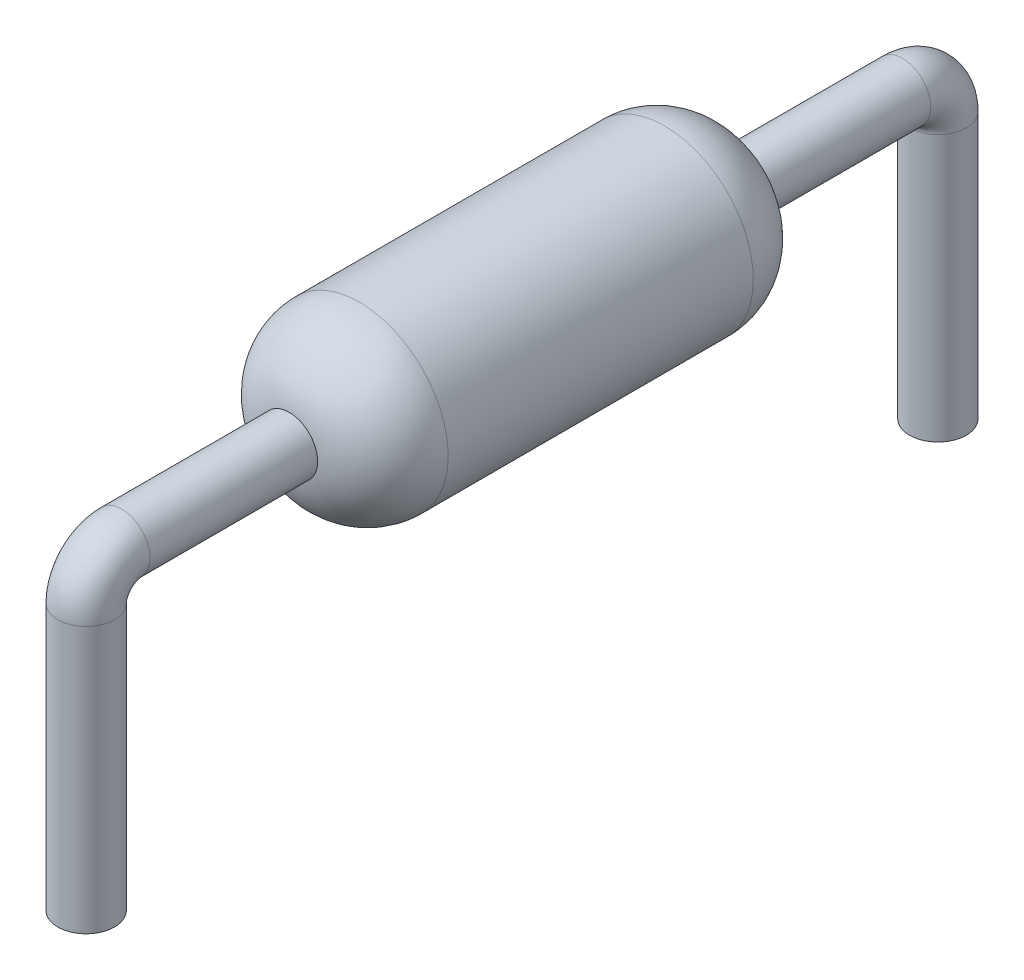
ISO-10303-21;
HEADER;
FILE_DESCRIPTION(('STEP AP214'),'2;1');
FILE_NAME('part.step','',(''),(''),'','','');
FILE_SCHEMA(('AUTOMOTIVE_DESIGN { 1 0 10303 214 1 1 1 1 }'));
ENDSEC;
DATA;
#1=APPLICATION_CONTEXT('core data for automotive mechanical design processes');
#2=APPLICATION_PROTOCOL_DEFINITION('international standard','automotive_design',2000,#1);
#3=PRODUCT_CONTEXT('',#1,'mechanical');
#4=PRODUCT('Part','Part','',(#3));
#5=PRODUCT_RELATED_PRODUCT_CATEGORY('part','',(#4));
#6=PRODUCT_DEFINITION_FORMATION('','',#4);
#7=PRODUCT_DEFINITION_CONTEXT('part definition',#1,'design');
#8=PRODUCT_DEFINITION('design','',#6,#7);
#9=PRODUCT_DEFINITION_SHAPE('','',#8);
#10=(LENGTH_UNIT() NAMED_UNIT(*) SI_UNIT(.MILLI.,.METRE.));
#11=(NAMED_UNIT(*) PLANE_ANGLE_UNIT() SI_UNIT($,.RADIAN.));
#12=(NAMED_UNIT(*) SI_UNIT($,.STERADIAN.) SOLID_ANGLE_UNIT());
#13=UNCERTAINTY_MEASURE_WITH_UNIT(LENGTH_MEASURE(1.E-05),#10,'distance_accuracy_value','');
#14=(GEOMETRIC_REPRESENTATION_CONTEXT(3) GLOBAL_UNCERTAINTY_ASSIGNED_CONTEXT((#13)) GLOBAL_UNIT_ASSIGNED_CONTEXT((#10,
#11,#12)) REPRESENTATION_CONTEXT('',''));
#15=CARTESIAN_POINT('',(0.,0.,0.));
#16=DIRECTION('',(0.,0.,1.));
#17=DIRECTION('',(1.,0.,0.));
#18=AXIS2_PLACEMENT_3D('',#15,#16,#17);
#19=CARTESIAN_POINT('',(0.,-4.25,9.15));
#20=DIRECTION('',(0.,-1.,0.));
#21=DIRECTION('',(0.,0.,-1.));
#22=AXIS2_PLACEMENT_3D('',#19,#20,#21);
#23=PLANE('',#22);
#24=CARTESIAN_POINT('',(0.,-4.25,9.15));
#25=DIRECTION('',(0.,-1.,0.));
#26=DIRECTION('',(1.,0.,0.));
#27=AXIS2_PLACEMENT_3D('',#24,#25,#26);
#28=CIRCLE('',#27,0.4);
#29=CARTESIAN_POINT('',(0.4,-4.25,9.15));
#30=VERTEX_POINT('',#29);
#31=EDGE_CURVE('E18',#30,#30,#28,.F.);
#32=ORIENTED_EDGE('',*,*,#31,.F.);
#33=EDGE_LOOP('',(#32));
#34=FACE_BOUND('',#33,.T.);
#35=ADVANCED_FACE('F15',(#34),#23,.T.);
#36=CARTESIAN_POINT('',(0.,-4.25,-2.85));
#37=DIRECTION('',(0.,1.,0.));
#38=DIRECTION('',(0.,0.,1.));
#39=AXIS2_PLACEMENT_3D('',#36,#37,#38);
#40=PLANE('',#39);
#41=CARTESIAN_POINT('',(0.,-4.25,-2.85));
#42=DIRECTION('',(0.,-1.,0.));
#43=DIRECTION('',(1.,0.,0.));
#44=AXIS2_PLACEMENT_3D('',#41,#42,#43);
#45=CIRCLE('',#44,0.4);
#46=CARTESIAN_POINT('',(0.4,-4.25,-2.85));
#47=VERTEX_POINT('',#46);
#48=EDGE_CURVE('E208',#47,#47,#45,.F.);
#49=ORIENTED_EDGE('',*,*,#48,.F.);
#50=EDGE_LOOP('',(#49));
#51=FACE_BOUND('',#50,.T.);
#52=ADVANCED_FACE('F78',(#51),#40,.F.);
#53=CARTESIAN_POINT('',(0.,-0.5,9.15));
#54=DIRECTION('',(0.,-1.,0.));
#55=DIRECTION('',(1.,0.,0.));
#56=AXIS2_PLACEMENT_3D('',#53,#54,#55);
#57=CYLINDRICAL_SURFACE('',#56,0.4);
#58=ORIENTED_EDGE('',*,*,#31,.T.);
#59=EDGE_LOOP('',(#58));
#60=FACE_BOUND('',#59,.T.);
#61=CARTESIAN_POINT('',(0.,-0.5,9.15));
#62=DIRECTION('',(0.,-1.,0.));
#63=DIRECTION('',(0.,0.,1.));
#64=AXIS2_PLACEMENT_3D('',#61,#62,#63);
#65=CIRCLE('',#64,0.4);
#66=CARTESIAN_POINT('',(0.,-0.500000000000001,9.55));
#67=VERTEX_POINT('',#66);
#68=EDGE_CURVE('E206',#67,#67,#65,.F.);
#69=ORIENTED_EDGE('',*,*,#68,.F.);
#70=EDGE_LOOP('',(#69));
#71=FACE_BOUND('',#70,.T.);
#72=ADVANCED_FACE('F75',(#60,#71),#57,.T.);
#73=CARTESIAN_POINT('',(0.,-0.5,-2.85));
#74=DIRECTION('',(0.,-1.,0.));
#75=DIRECTION('',(1.,0.,0.));
#76=AXIS2_PLACEMENT_3D('',#73,#74,#75);
#77=CYLINDRICAL_SURFACE('',#76,0.4);
#78=ORIENTED_EDGE('',*,*,#48,.T.);
#79=EDGE_LOOP('',(#78));
#80=FACE_BOUND('',#79,.T.);
#81=CARTESIAN_POINT('',(0.,-0.5,-2.85));
#82=DIRECTION('',(0.,-1.,0.));
#83=DIRECTION('',(0.,0.,-1.));
#84=AXIS2_PLACEMENT_3D('',#81,#82,#83);
#85=CIRCLE('',#84,0.4);
#86=CARTESIAN_POINT('',(0.,-0.5,-3.25));
#87=VERTEX_POINT('',#86);
#88=EDGE_CURVE('E57',#87,#87,#85,.F.);
#89=ORIENTED_EDGE('',*,*,#88,.F.);
#90=EDGE_LOOP('',(#89));
#91=FACE_BOUND('',#90,.T.);
#92=ADVANCED_FACE('F71',(#80,#91),#77,.T.);
#93=CARTESIAN_POINT('',(0.,-0.5,8.65));
#94=DIRECTION('',(1.,0.,0.));
#95=DIRECTION('',(0.,0.,-1.));
#96=AXIS2_PLACEMENT_3D('',#93,#94,#95);
#97=TOROIDAL_SURFACE('',#96,0.5,0.4);
#98=CARTESIAN_POINT('',(0.,0.,8.65));
#99=DIRECTION('',(0.,0.,-1.));
#100=DIRECTION('',(-1.,0.,0.));
#101=AXIS2_PLACEMENT_3D('',#98,#99,#100);
#102=CIRCLE('',#101,0.4);
#103=CARTESIAN_POINT('',(-0.4,0.,8.65));
#104=VERTEX_POINT('',#103);
#105=EDGE_CURVE('E54',#104,#104,#102,.T.);
#106=ORIENTED_EDGE('',*,*,#105,.F.);
#107=EDGE_LOOP('',(#106));
#108=FACE_BOUND('',#107,.T.);
#109=ORIENTED_EDGE('',*,*,#68,.T.);
#110=EDGE_LOOP('',(#109));
#111=FACE_BOUND('',#110,.T.);
#112=ADVANCED_FACE('F67',(#108,#111),#97,.T.);
#113=CARTESIAN_POINT('',(0.,-0.5,-2.35));
#114=DIRECTION('',(-1.,0.,0.));
#115=DIRECTION('',(0.,0.,1.));
#116=AXIS2_PLACEMENT_3D('',#113,#114,#115);
#117=TOROIDAL_SURFACE('',#116,0.5,0.4);
#118=ORIENTED_EDGE('',*,*,#88,.T.);
#119=EDGE_LOOP('',(#118));
#120=FACE_BOUND('',#119,.T.);
#121=CARTESIAN_POINT('',(0.,0.,-2.35));
#122=DIRECTION('',(0.,0.,1.));
#123=DIRECTION('',(1.,0.,0.));
#124=AXIS2_PLACEMENT_3D('',#121,#122,#123);
#125=CIRCLE('',#124,0.4);
#126=CARTESIAN_POINT('',(0.4,0.,-2.35));
#127=VERTEX_POINT('',#126);
#128=EDGE_CURVE('E51',#127,#127,#125,.T.);
#129=ORIENTED_EDGE('',*,*,#128,.F.);
#130=EDGE_LOOP('',(#129));
#131=FACE_BOUND('',#130,.T.);
#132=ADVANCED_FACE('F63',(#120,#131),#117,.T.);
#133=CARTESIAN_POINT('',(0.,0.,8.65));
#134=DIRECTION('',(0.,0.,-1.));
#135=DIRECTION('',(-1.,0.,0.));
#136=AXIS2_PLACEMENT_3D('',#133,#134,#135);
#137=CYLINDRICAL_SURFACE('',#136,0.4);
#138=CARTESIAN_POINT('',(0.,0.,6.28868599666426));
#139=DIRECTION('',(0.,0.,1.));
#140=DIRECTION('',(1.,0.,0.));
#141=AXIS2_PLACEMENT_3D('',#138,#139,#140);
#142=CIRCLE('',#141,0.4);
#143=CARTESIAN_POINT('',(0.4,0.,6.28868599666426));
#144=VERTEX_POINT('',#143);
#145=EDGE_CURVE('E48',#144,#144,#142,.F.);
#146=ORIENTED_EDGE('',*,*,#145,.F.);
#147=EDGE_LOOP('',(#146));
#148=FACE_BOUND('',#147,.T.);
#149=ORIENTED_EDGE('',*,*,#105,.T.);
#150=EDGE_LOOP('',(#149));
#151=FACE_BOUND('',#150,.T.);
#152=ADVANCED_FACE('F66',(#148,#151),#137,.T.);
#153=CARTESIAN_POINT('',(0.,0.,-2.35));
#154=DIRECTION('',(0.,0.,1.));
#155=DIRECTION('',(1.,0.,0.));
#156=AXIS2_PLACEMENT_3D('',#153,#154,#155);
#157=CYLINDRICAL_SURFACE('',#156,0.4);
#158=CARTESIAN_POINT('',(0.,0.,0.0113140033357407));
#159=DIRECTION('',(0.,0.,1.));
#160=DIRECTION('',(1.,0.,0.));
#161=AXIS2_PLACEMENT_3D('',#158,#159,#160);
#162=CIRCLE('',#161,0.4);
#163=CARTESIAN_POINT('',(0.4,0.,0.0113140033357407));
#164=VERTEX_POINT('',#163);
#165=EDGE_CURVE('E27',#164,#164,#162,.T.);
#166=ORIENTED_EDGE('',*,*,#165,.F.);
#167=EDGE_LOOP('',(#166));
#168=FACE_BOUND('',#167,.T.);
#169=ORIENTED_EDGE('',*,*,#128,.T.);
#170=EDGE_LOOP('',(#169));
#171=FACE_BOUND('',#170,.T.);
#172=ADVANCED_FACE('F43',(#168,#171),#157,.T.);
#173=CARTESIAN_POINT('',(0.25,0.,5.3));
#174=DIRECTION('',(0.,1.,0.));
#175=DIRECTION('',(1.,0.,0.));
#176=AXIS2_PLACEMENT_3D('',#173,#174,#175);
#177=CIRCLE('',#176,1.);
#178=TRIMMED_CURVE('',#177,(PARAMETER_VALUE(-1.82347658193698)),
(PARAMETER_VALUE(1.82347658193698)),.T.,.PARAMETER.);
#179=CARTESIAN_POINT('',(0.,0.,5.3));
#180=DIRECTION('',(0.,0.,1.));
#181=AXIS1_PLACEMENT('',#179,#180);
#182=SURFACE_OF_REVOLUTION('',#178,#181);
#183=ORIENTED_EDGE('',*,*,#145,.T.);
#184=EDGE_LOOP('',(#183));
#185=FACE_BOUND('',#184,.T.);
#186=CARTESIAN_POINT('',(0.,0.,5.3));
#187=DIRECTION('',(0.,0.,-1.));
#188=DIRECTION('',(-1.,0.,0.));
#189=AXIS2_PLACEMENT_3D('',#186,#187,#188);
#190=CIRCLE('',#189,1.25);
#191=CARTESIAN_POINT('',(-1.25,0.,5.3));
#192=VERTEX_POINT('',#191);
#193=EDGE_CURVE('E22',#192,#192,#190,.T.);
#194=ORIENTED_EDGE('',*,*,#193,.F.);
#195=EDGE_LOOP('',(#194));
#196=FACE_BOUND('',#195,.T.);
#197=ADVANCED_FACE('F39',(#185,#196),#182,.F.);
#198=CARTESIAN_POINT('',(0.25,0.,1.));
#199=DIRECTION('',(0.,1.,0.));
#200=DIRECTION('',(1.,0.,0.));
#201=AXIS2_PLACEMENT_3D('',#198,#199,#200);
#202=CIRCLE('',#201,1.);
#203=TRIMMED_CURVE('',#202,(PARAMETER_VALUE(-1.82347658193698)),
(PARAMETER_VALUE(1.82347658193698)),.T.,.PARAMETER.);
#204=CARTESIAN_POINT('',(0.,0.,1.));
#205=DIRECTION('',(0.,0.,1.));
#206=AXIS1_PLACEMENT('',#204,#205);
#207=SURFACE_OF_REVOLUTION('',#203,#206);
#208=CARTESIAN_POINT('',(0.,0.,1.));
#209=DIRECTION('',(0.,0.,-1.));
#210=DIRECTION('',(-1.,0.,0.));
#211=AXIS2_PLACEMENT_3D('',#208,#209,#210);
#212=CIRCLE('',#211,1.25);
#213=CARTESIAN_POINT('',(-1.25,0.,1.));
#214=VERTEX_POINT('',#213);
#215=EDGE_CURVE('E10',#214,#214,#212,.F.);
#216=ORIENTED_EDGE('',*,*,#215,.F.);
#217=EDGE_LOOP('',(#216));
#218=FACE_BOUND('',#217,.T.);
#219=ORIENTED_EDGE('',*,*,#165,.T.);
#220=EDGE_LOOP('',(#219));
#221=FACE_BOUND('',#220,.T.);
#222=ADVANCED_FACE('F34',(#218,#221),#207,.F.);
#223=CARTESIAN_POINT('',(0.,0.,6.3));
#224=DIRECTION('',(0.,0.,-1.));
#225=DIRECTION('',(-1.,0.,0.));
#226=AXIS2_PLACEMENT_3D('',#223,#224,#225);
#227=CYLINDRICAL_SURFACE('',#226,1.25);
#228=ORIENTED_EDGE('',*,*,#215,.T.);
#229=EDGE_LOOP('',(#228));
#230=FACE_BOUND('',#229,.T.);
#231=ORIENTED_EDGE('',*,*,#193,.T.);
#232=EDGE_LOOP('',(#231));
#233=FACE_BOUND('',#232,.T.);
#234=ADVANCED_FACE('F38',(#230,#233),#227,.T.);
#235=CLOSED_SHELL('',(#35,#52,#72,#92,#112,#132,#152,#172,#197,#222,#234));
#236=MANIFOLD_SOLID_BREP('B1',#235);
#237=ADVANCED_BREP_SHAPE_REPRESENTATION('',(#18,#236),#14);
#238=SHAPE_DEFINITION_REPRESENTATION(#9,#237);
ENDSEC;
END-ISO-10303-21;
